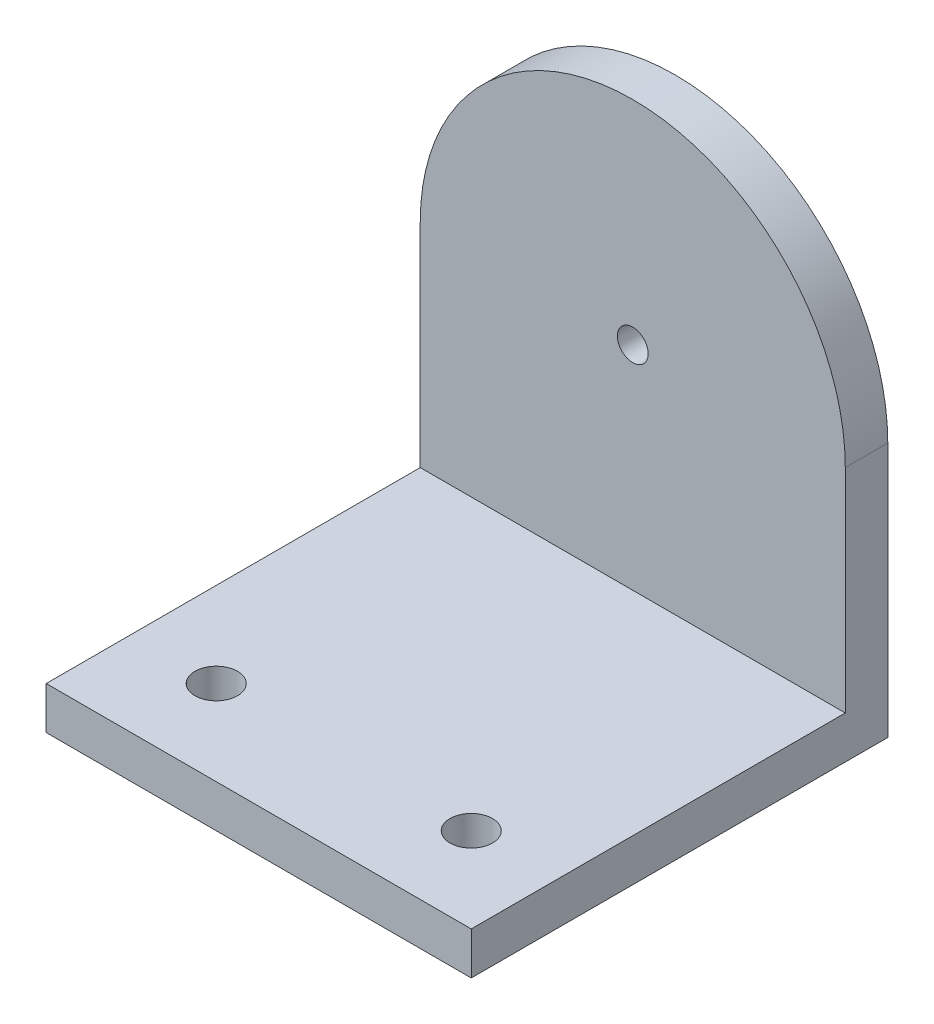
ISO-10303-21;
HEADER;
FILE_DESCRIPTION(('STEP AP214'),'2;1');
FILE_NAME('part.step','',(''),(''),'','','');
FILE_SCHEMA(('AUTOMOTIVE_DESIGN { 1 0 10303 214 1 1 1 1 }'));
ENDSEC;
DATA;
#1=APPLICATION_CONTEXT('core data for automotive mechanical design processes');
#2=APPLICATION_PROTOCOL_DEFINITION('international standard','automotive_design',2000,#1);
#3=PRODUCT_CONTEXT('',#1,'mechanical');
#4=PRODUCT('Part','Part','',(#3));
#5=PRODUCT_RELATED_PRODUCT_CATEGORY('part','',(#4));
#6=PRODUCT_DEFINITION_FORMATION('','',#4);
#7=PRODUCT_DEFINITION_CONTEXT('part definition',#1,'design');
#8=PRODUCT_DEFINITION('design','',#6,#7);
#9=PRODUCT_DEFINITION_SHAPE('','',#8);
#10=(LENGTH_UNIT() NAMED_UNIT(*) SI_UNIT(.MILLI.,.METRE.));
#11=(NAMED_UNIT(*) PLANE_ANGLE_UNIT() SI_UNIT($,.RADIAN.));
#12=(NAMED_UNIT(*) SI_UNIT($,.STERADIAN.) SOLID_ANGLE_UNIT());
#13=UNCERTAINTY_MEASURE_WITH_UNIT(LENGTH_MEASURE(1.E-05),#10,'distance_accuracy_value','');
#14=(GEOMETRIC_REPRESENTATION_CONTEXT(3) GLOBAL_UNCERTAINTY_ASSIGNED_CONTEXT((#13)) GLOBAL_UNIT_ASSIGNED_CONTEXT((#10,
#11,#12)) REPRESENTATION_CONTEXT('',''));
#15=CARTESIAN_POINT('',(0.,0.,0.));
#16=DIRECTION('',(0.,0.,1.));
#17=DIRECTION('',(1.,0.,0.));
#18=AXIS2_PLACEMENT_3D('',#15,#16,#17);
#19=CARTESIAN_POINT('',(0.,0.,3.175));
#20=DIRECTION('',(0.,0.,-1.));
#21=DIRECTION('',(-1.,0.,0.));
#22=AXIS2_PLACEMENT_3D('',#19,#20,#21);
#23=CYLINDRICAL_SURFACE('',#22,15.875);
#24=CARTESIAN_POINT('',(0.,0.,3.175));
#25=DIRECTION('',(0.,0.,1.));
#26=DIRECTION('',(1.,0.,0.));
#27=AXIS2_PLACEMENT_3D('',#24,#25,#26);
#28=CIRCLE('',#27,15.875);
#29=CARTESIAN_POINT('',(15.875,0.,3.175));
#30=VERTEX_POINT('',#29);
#31=CARTESIAN_POINT('',(-15.875,0.,3.175));
#32=VERTEX_POINT('',#31);
#33=EDGE_CURVE('E149',#30,#32,#28,.T.);
#34=ORIENTED_EDGE('',*,*,#33,.F.);
#35=DIRECTION('',(0.,0.,-1.));
#36=VECTOR('',#35,1.);
#37=CARTESIAN_POINT('',(15.875,0.,3.175));
#38=LINE('',#37,#36);
#39=CARTESIAN_POINT('',(15.875,0.,0.));
#40=VERTEX_POINT('',#39);
#41=EDGE_CURVE('E12',#30,#40,#38,.T.);
#42=ORIENTED_EDGE('',*,*,#41,.T.);
#43=CARTESIAN_POINT('',(0.,0.,0.));
#44=DIRECTION('',(0.,0.,1.));
#45=DIRECTION('',(1.,0.,0.));
#46=AXIS2_PLACEMENT_3D('',#43,#44,#45);
#47=CIRCLE('',#46,15.875);
#48=CARTESIAN_POINT('',(-15.875,0.,0.));
#49=VERTEX_POINT('',#48);
#50=EDGE_CURVE('E152',#40,#49,#47,.T.);
#51=ORIENTED_EDGE('',*,*,#50,.T.);
#52=DIRECTION('',(0.,0.,-1.));
#53=VECTOR('',#52,1.);
#54=CARTESIAN_POINT('',(-15.875,0.,3.175));
#55=LINE('',#54,#53);
#56=EDGE_CURVE('E65',#32,#49,#55,.T.);
#57=ORIENTED_EDGE('',*,*,#56,.F.);
#58=EDGE_LOOP('',(#34,#42,#51,#57));
#59=FACE_BOUND('',#58,.T.);
#60=ADVANCED_FACE('F56',(#59),#23,.T.);
#61=CARTESIAN_POINT('',(0.,0.,0.));
#62=DIRECTION('',(0.,0.,1.));
#63=DIRECTION('',(1.,0.,0.));
#64=AXIS2_PLACEMENT_3D('',#61,#62,#63);
#65=PLANE('',#64);
#66=CARTESIAN_POINT('',(0.,0.,0.));
#67=DIRECTION('',(0.,0.,1.));
#68=DIRECTION('',(1.,0.,0.));
#69=AXIS2_PLACEMENT_3D('',#66,#67,#68);
#70=CIRCLE('',#69,1.15);
#71=CARTESIAN_POINT('',(1.15,0.,0.));
#72=VERTEX_POINT('',#71);
#73=EDGE_CURVE('E217',#72,#72,#70,.T.);
#74=ORIENTED_EDGE('',*,*,#73,.T.);
#75=EDGE_LOOP('',(#74));
#76=FACE_BOUND('',#75,.T.);
#77=ORIENTED_EDGE('',*,*,#50,.F.);
#78=DIRECTION('',(0.,-1.,0.));
#79=VECTOR('',#78,1.);
#80=CARTESIAN_POINT('',(15.875,0.,0.));
#81=LINE('',#80,#79);
#82=CARTESIAN_POINT('',(15.875,-19.05,0.));
#83=VERTEX_POINT('',#82);
#84=EDGE_CURVE('E159',#40,#83,#81,.T.);
#85=ORIENTED_EDGE('',*,*,#84,.T.);
#86=DIRECTION('',(1.,0.,0.));
#87=VECTOR('',#86,1.);
#88=CARTESIAN_POINT('',(-15.875,-19.05,0.));
#89=LINE('',#88,#87);
#90=CARTESIAN_POINT('',(-15.875,-19.05,0.));
#91=VERTEX_POINT('',#90);
#92=EDGE_CURVE('E148',#91,#83,#89,.T.);
#93=ORIENTED_EDGE('',*,*,#92,.F.);
#94=DIRECTION('',(0.,-1.,0.));
#95=VECTOR('',#94,1.);
#96=CARTESIAN_POINT('',(-15.875,0.,0.));
#97=LINE('',#96,#95);
#98=EDGE_CURVE('E97',#49,#91,#97,.T.);
#99=ORIENTED_EDGE('',*,*,#98,.F.);
#100=EDGE_LOOP('',(#77,#85,#93,#99));
#101=FACE_BOUND('',#100,.T.);
#102=ADVANCED_FACE('F164',(#76,#101),#65,.F.);
#103=CARTESIAN_POINT('',(0.,0.,3.175));
#104=DIRECTION('',(0.,0.,1.));
#105=DIRECTION('',(1.,0.,0.));
#106=AXIS2_PLACEMENT_3D('',#103,#104,#105);
#107=PLANE('',#106);
#108=CARTESIAN_POINT('',(0.,0.,3.175));
#109=DIRECTION('',(0.,0.,1.));
#110=DIRECTION('',(1.,0.,0.));
#111=AXIS2_PLACEMENT_3D('',#108,#109,#110);
#112=CIRCLE('',#111,1.15);
#113=CARTESIAN_POINT('',(1.15,0.,3.175));
#114=VERTEX_POINT('',#113);
#115=EDGE_CURVE('E219',#114,#114,#112,.T.);
#116=ORIENTED_EDGE('',*,*,#115,.F.);
#117=EDGE_LOOP('',(#116));
#118=FACE_BOUND('',#117,.T.);
#119=DIRECTION('',(-1.,0.,0.));
#120=VECTOR('',#119,1.);
#121=CARTESIAN_POINT('',(-15.875,-15.875,3.175));
#122=LINE('',#121,#120);
#123=CARTESIAN_POINT('',(15.875,-15.875,3.175));
#124=VERTEX_POINT('',#123);
#125=CARTESIAN_POINT('',(-15.875,-15.875,3.175));
#126=VERTEX_POINT('',#125);
#127=EDGE_CURVE('E73',#124,#126,#122,.T.);
#128=ORIENTED_EDGE('',*,*,#127,.F.);
#129=DIRECTION('',(0.,-1.,0.));
#130=VECTOR('',#129,1.);
#131=CARTESIAN_POINT('',(15.875,0.,3.175));
#132=LINE('',#131,#130);
#133=EDGE_CURVE('E155',#30,#124,#132,.T.);
#134=ORIENTED_EDGE('',*,*,#133,.F.);
#135=ORIENTED_EDGE('',*,*,#33,.T.);
#136=DIRECTION('',(0.,-1.,0.));
#137=VECTOR('',#136,1.);
#138=CARTESIAN_POINT('',(-15.875,0.,3.175));
#139=LINE('',#138,#137);
#140=EDGE_CURVE('E123',#32,#126,#139,.T.);
#141=ORIENTED_EDGE('',*,*,#140,.T.);
#142=EDGE_LOOP('',(#128,#134,#135,#141));
#143=FACE_BOUND('',#142,.T.);
#144=ADVANCED_FACE('F170',(#118,#143),#107,.T.);
#145=CARTESIAN_POINT('',(-15.875,0.,3.175));
#146=DIRECTION('',(1.,0.,0.));
#147=DIRECTION('',(0.,1.,0.));
#148=AXIS2_PLACEMENT_3D('',#145,#146,#147);
#149=PLANE('',#148);
#150=ORIENTED_EDGE('',*,*,#98,.T.);
#151=DIRECTION('',(0.,0.,-1.));
#152=VECTOR('',#151,1.);
#153=CARTESIAN_POINT('',(-15.875,-19.05,3.175));
#154=LINE('',#153,#152);
#155=CARTESIAN_POINT('',(-15.875,-19.05,31.115));
#156=VERTEX_POINT('',#155);
#157=EDGE_CURVE('E114',#156,#91,#154,.T.);
#158=ORIENTED_EDGE('',*,*,#157,.F.);
#159=DIRECTION('',(0.,-1.,0.));
#160=VECTOR('',#159,1.);
#161=CARTESIAN_POINT('',(-15.875,-19.05,31.115));
#162=LINE('',#161,#160);
#163=CARTESIAN_POINT('',(-15.875,-15.875,31.115));
#164=VERTEX_POINT('',#163);
#165=EDGE_CURVE('E119',#164,#156,#162,.T.);
#166=ORIENTED_EDGE('',*,*,#165,.F.);
#167=DIRECTION('',(0.,0.,-1.));
#168=VECTOR('',#167,1.);
#169=CARTESIAN_POINT('',(-15.875,-15.875,31.115));
#170=LINE('',#169,#168);
#171=EDGE_CURVE('E142',#164,#126,#170,.T.);
#172=ORIENTED_EDGE('',*,*,#171,.T.);
#173=ORIENTED_EDGE('',*,*,#140,.F.);
#174=ORIENTED_EDGE('',*,*,#56,.T.);
#175=EDGE_LOOP('',(#150,#158,#166,#172,#173,#174));
#176=FACE_BOUND('',#175,.T.);
#177=ADVANCED_FACE('F116',(#176),#149,.F.);
#178=CARTESIAN_POINT('',(-15.875,-19.05,3.175));
#179=DIRECTION('',(0.,1.,0.));
#180=DIRECTION('',(0.,0.,1.));
#181=AXIS2_PLACEMENT_3D('',#178,#179,#180);
#182=PLANE('',#181);
#183=CARTESIAN_POINT('',(-9.525,-19.05,24.765));
#184=DIRECTION('',(0.,1.,0.));
#185=DIRECTION('',(0.,0.,1.));
#186=AXIS2_PLACEMENT_3D('',#183,#184,#185);
#187=CIRCLE('',#186,1.5875);
#188=CARTESIAN_POINT('',(-9.525,-19.05,26.3525));
#189=VERTEX_POINT('',#188);
#190=EDGE_CURVE('E135',#189,#189,#187,.T.);
#191=ORIENTED_EDGE('',*,*,#190,.T.);
#192=EDGE_LOOP('',(#191));
#193=FACE_BOUND('',#192,.T.);
#194=CARTESIAN_POINT('',(9.525,-19.05,24.765));
#195=DIRECTION('',(0.,1.,0.));
#196=DIRECTION('',(0.,0.,-1.));
#197=AXIS2_PLACEMENT_3D('',#194,#195,#196);
#198=CIRCLE('',#197,1.5875);
#199=CARTESIAN_POINT('',(9.525,-19.05,23.1775));
#200=VERTEX_POINT('',#199);
#201=EDGE_CURVE('E138',#200,#200,#198,.T.);
#202=ORIENTED_EDGE('',*,*,#201,.T.);
#203=EDGE_LOOP('',(#202));
#204=FACE_BOUND('',#203,.T.);
#205=ORIENTED_EDGE('',*,*,#92,.T.);
#206=DIRECTION('',(0.,0.,-1.));
#207=VECTOR('',#206,1.);
#208=CARTESIAN_POINT('',(15.875,-19.05,3.175));
#209=LINE('',#208,#207);
#210=CARTESIAN_POINT('',(15.875,-19.05,31.115));
#211=VERTEX_POINT('',#210);
#212=EDGE_CURVE('E60',#211,#83,#209,.T.);
#213=ORIENTED_EDGE('',*,*,#212,.F.);
#214=DIRECTION('',(1.,0.,0.));
#215=VECTOR('',#214,1.);
#216=CARTESIAN_POINT('',(-15.875,-19.05,31.115));
#217=LINE('',#216,#215);
#218=EDGE_CURVE('E125',#156,#211,#217,.T.);
#219=ORIENTED_EDGE('',*,*,#218,.F.);
#220=ORIENTED_EDGE('',*,*,#157,.T.);
#221=EDGE_LOOP('',(#205,#213,#219,#220));
#222=FACE_BOUND('',#221,.T.);
#223=ADVANCED_FACE('F58',(#193,#204,#222),#182,.F.);
#224=CARTESIAN_POINT('',(15.875,0.,3.175));
#225=DIRECTION('',(1.,0.,0.));
#226=DIRECTION('',(0.,1.,0.));
#227=AXIS2_PLACEMENT_3D('',#224,#225,#226);
#228=PLANE('',#227);
#229=ORIENTED_EDGE('',*,*,#84,.F.);
#230=ORIENTED_EDGE('',*,*,#41,.F.);
#231=ORIENTED_EDGE('',*,*,#133,.T.);
#232=DIRECTION('',(0.,0.,-1.));
#233=VECTOR('',#232,1.);
#234=CARTESIAN_POINT('',(15.875,-15.875,31.115));
#235=LINE('',#234,#233);
#236=CARTESIAN_POINT('',(15.875,-15.875,31.115));
#237=VERTEX_POINT('',#236);
#238=EDGE_CURVE('E145',#237,#124,#235,.T.);
#239=ORIENTED_EDGE('',*,*,#238,.F.);
#240=DIRECTION('',(0.,1.,0.));
#241=VECTOR('',#240,1.);
#242=CARTESIAN_POINT('',(15.875,-19.05,31.115));
#243=LINE('',#242,#241);
#244=EDGE_CURVE('E128',#211,#237,#243,.T.);
#245=ORIENTED_EDGE('',*,*,#244,.F.);
#246=ORIENTED_EDGE('',*,*,#212,.T.);
#247=EDGE_LOOP('',(#229,#230,#231,#239,#245,#246));
#248=FACE_BOUND('',#247,.T.);
#249=ADVANCED_FACE('F166',(#248),#228,.T.);
#250=CARTESIAN_POINT('',(-15.875,-15.875,31.115));
#251=DIRECTION('',(0.,-1.,0.));
#252=DIRECTION('',(0.,0.,-1.));
#253=AXIS2_PLACEMENT_3D('',#250,#251,#252);
#254=PLANE('',#253);
#255=CARTESIAN_POINT('',(-9.525,-15.875,24.765));
#256=DIRECTION('',(0.,1.,0.));
#257=DIRECTION('',(0.,0.,1.));
#258=AXIS2_PLACEMENT_3D('',#255,#256,#257);
#259=CIRCLE('',#258,1.5875);
#260=CARTESIAN_POINT('',(-9.525,-15.875,26.3525));
#261=VERTEX_POINT('',#260);
#262=EDGE_CURVE('E224',#261,#261,#259,.T.);
#263=ORIENTED_EDGE('',*,*,#262,.F.);
#264=EDGE_LOOP('',(#263));
#265=FACE_BOUND('',#264,.T.);
#266=CARTESIAN_POINT('',(9.525,-15.875,24.765));
#267=DIRECTION('',(0.,1.,0.));
#268=DIRECTION('',(0.,0.,-1.));
#269=AXIS2_PLACEMENT_3D('',#266,#267,#268);
#270=CIRCLE('',#269,1.5875);
#271=CARTESIAN_POINT('',(9.525,-15.875,23.1775));
#272=VERTEX_POINT('',#271);
#273=EDGE_CURVE('E226',#272,#272,#270,.T.);
#274=ORIENTED_EDGE('',*,*,#273,.F.);
#275=EDGE_LOOP('',(#274));
#276=FACE_BOUND('',#275,.T.);
#277=ORIENTED_EDGE('',*,*,#127,.T.);
#278=ORIENTED_EDGE('',*,*,#171,.F.);
#279=DIRECTION('',(-1.,0.,0.));
#280=VECTOR('',#279,1.);
#281=CARTESIAN_POINT('',(-15.875,-15.875,31.115));
#282=LINE('',#281,#280);
#283=EDGE_CURVE('E132',#237,#164,#282,.T.);
#284=ORIENTED_EDGE('',*,*,#283,.F.);
#285=ORIENTED_EDGE('',*,*,#238,.T.);
#286=EDGE_LOOP('',(#277,#278,#284,#285));
#287=FACE_BOUND('',#286,.T.);
#288=ADVANCED_FACE('F169',(#265,#276,#287),#254,.F.);
#289=CARTESIAN_POINT('',(0.,0.,31.115));
#290=DIRECTION('',(0.,0.,-1.));
#291=DIRECTION('',(-1.,0.,0.));
#292=AXIS2_PLACEMENT_3D('',#289,#290,#291);
#293=PLANE('',#292);
#294=ORIENTED_EDGE('',*,*,#165,.T.);
#295=ORIENTED_EDGE('',*,*,#218,.T.);
#296=ORIENTED_EDGE('',*,*,#244,.T.);
#297=ORIENTED_EDGE('',*,*,#283,.T.);
#298=EDGE_LOOP('',(#294,#295,#296,#297));
#299=FACE_BOUND('',#298,.T.);
#300=ADVANCED_FACE('F130',(#299),#293,.F.);
#301=CARTESIAN_POINT('',(9.525,-19.05,24.765));
#302=DIRECTION('',(0.,1.,0.));
#303=DIRECTION('',(0.,0.,1.));
#304=AXIS2_PLACEMENT_3D('',#301,#302,#303);
#305=CYLINDRICAL_SURFACE('',#304,1.5875);
#306=ORIENTED_EDGE('',*,*,#201,.F.);
#307=EDGE_LOOP('',(#306));
#308=FACE_BOUND('',#307,.T.);
#309=ORIENTED_EDGE('',*,*,#273,.T.);
#310=EDGE_LOOP('',(#309));
#311=FACE_BOUND('',#310,.T.);
#312=ADVANCED_FACE('F202',(#308,#311),#305,.F.);
#313=CARTESIAN_POINT('',(-9.525,-19.05,24.765));
#314=DIRECTION('',(0.,1.,0.));
#315=DIRECTION('',(0.,0.,1.));
#316=AXIS2_PLACEMENT_3D('',#313,#314,#315);
#317=CYLINDRICAL_SURFACE('',#316,1.5875);
#318=ORIENTED_EDGE('',*,*,#190,.F.);
#319=EDGE_LOOP('',(#318));
#320=FACE_BOUND('',#319,.T.);
#321=ORIENTED_EDGE('',*,*,#262,.T.);
#322=EDGE_LOOP('',(#321));
#323=FACE_BOUND('',#322,.T.);
#324=ADVANCED_FACE('F205',(#320,#323),#317,.F.);
#325=CARTESIAN_POINT('',(0.,0.,0.));
#326=DIRECTION('',(0.,0.,1.));
#327=DIRECTION('',(1.,0.,0.));
#328=AXIS2_PLACEMENT_3D('',#325,#326,#327);
#329=CYLINDRICAL_SURFACE('',#328,1.15);
#330=ORIENTED_EDGE('',*,*,#73,.F.);
#331=EDGE_LOOP('',(#330));
#332=FACE_BOUND('',#331,.T.);
#333=ORIENTED_EDGE('',*,*,#115,.T.);
#334=EDGE_LOOP('',(#333));
#335=FACE_BOUND('',#334,.T.);
#336=ADVANCED_FACE('F209',(#332,#335),#329,.F.);
#337=CLOSED_SHELL('',(#60,#102,#144,#177,#223,#249,#288,#300,#312,#324,#336));
#338=MANIFOLD_SOLID_BREP('B2',#337);
#339=ADVANCED_BREP_SHAPE_REPRESENTATION('',(#18,#338),#14);
#340=SHAPE_DEFINITION_REPRESENTATION(#9,#339);
ENDSEC;
END-ISO-10303-21;
